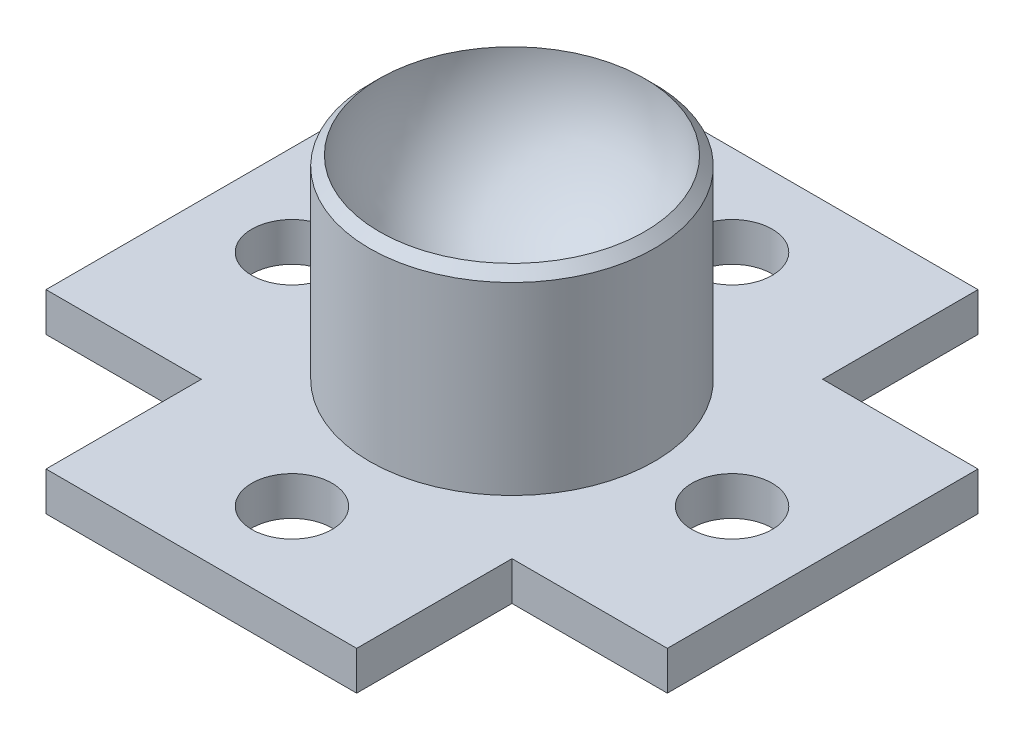
ISO-10303-21;
HEADER;
FILE_DESCRIPTION(('STEP AP214'),'2;1');
FILE_NAME('part.step','',(''),(''),'','','');
FILE_SCHEMA(('AUTOMOTIVE_DESIGN { 1 0 10303 214 1 1 1 1 }'));
ENDSEC;
DATA;
#1=APPLICATION_CONTEXT('core data for automotive mechanical design processes');
#2=APPLICATION_PROTOCOL_DEFINITION('international standard','automotive_design',2000,#1);
#3=PRODUCT_CONTEXT('',#1,'mechanical');
#4=PRODUCT('Part','Part','',(#3));
#5=PRODUCT_RELATED_PRODUCT_CATEGORY('part','',(#4));
#6=PRODUCT_DEFINITION_FORMATION('','',#4);
#7=PRODUCT_DEFINITION_CONTEXT('part definition',#1,'design');
#8=PRODUCT_DEFINITION('design','',#6,#7);
#9=PRODUCT_DEFINITION_SHAPE('','',#8);
#10=(LENGTH_UNIT() NAMED_UNIT(*) SI_UNIT(.MILLI.,.METRE.));
#11=(NAMED_UNIT(*) PLANE_ANGLE_UNIT() SI_UNIT($,.RADIAN.));
#12=(NAMED_UNIT(*) SI_UNIT($,.STERADIAN.) SOLID_ANGLE_UNIT());
#13=UNCERTAINTY_MEASURE_WITH_UNIT(LENGTH_MEASURE(1.E-05),#10,'distance_accuracy_value','');
#14=(GEOMETRIC_REPRESENTATION_CONTEXT(3) GLOBAL_UNCERTAINTY_ASSIGNED_CONTEXT((#13)) GLOBAL_UNIT_ASSIGNED_CONTEXT((#10,
#11,#12)) REPRESENTATION_CONTEXT('',''));
#15=CARTESIAN_POINT('',(0.,0.,0.));
#16=DIRECTION('',(0.,0.,1.));
#17=DIRECTION('',(1.,0.,0.));
#18=AXIS2_PLACEMENT_3D('',#15,#16,#17);
#19=CARTESIAN_POINT('',(0.,3.,0.));
#20=DIRECTION('',(0.,1.,0.));
#21=DIRECTION('',(0.,0.,1.));
#22=AXIS2_PLACEMENT_3D('',#19,#20,#21);
#23=PLANE('',#22);
#24=CARTESIAN_POINT('',(0.,3.,0.));
#25=DIRECTION('',(0.,1.,0.));
#26=DIRECTION('',(0.,0.,1.));
#27=AXIS2_PLACEMENT_3D('',#24,#25,#26);
#28=CIRCLE('',#27,11.);
#29=CARTESIAN_POINT('',(0.,3.,11.));
#30=VERTEX_POINT('',#29);
#31=EDGE_CURVE('E432',#30,#30,#28,.T.);
#32=ORIENTED_EDGE('',*,*,#31,.F.);
#33=EDGE_LOOP('',(#32));
#34=FACE_BOUND('',#33,.T.);
#35=CARTESIAN_POINT('',(-17.,3.,0.));
#36=DIRECTION('',(0.,1.,0.));
#37=DIRECTION('',(0.,0.,1.));
#38=AXIS2_PLACEMENT_3D('',#35,#36,#37);
#39=CIRCLE('',#38,3.1);
#40=CARTESIAN_POINT('',(-17.,3.,3.1));
#41=VERTEX_POINT('',#40);
#42=EDGE_CURVE('E330',#41,#41,#39,.T.);
#43=ORIENTED_EDGE('',*,*,#42,.F.);
#44=EDGE_LOOP('',(#43));
#45=FACE_BOUND('',#44,.T.);
#46=DIRECTION('',(0.,0.,1.));
#47=VECTOR('',#46,1.);
#48=CARTESIAN_POINT('',(-24.,3.,-12.));
#49=LINE('',#48,#47);
#50=CARTESIAN_POINT('',(-24.,3.,-12.));
#51=VERTEX_POINT('',#50);
#52=CARTESIAN_POINT('',(-24.,3.,12.));
#53=VERTEX_POINT('',#52);
#54=EDGE_CURVE('E357',#51,#53,#49,.T.);
#55=ORIENTED_EDGE('',*,*,#54,.T.);
#56=DIRECTION('',(1.,0.,0.));
#57=VECTOR('',#56,1.);
#58=CARTESIAN_POINT('',(-24.,3.,12.));
#59=LINE('',#58,#57);
#60=CARTESIAN_POINT('',(-12.,3.,12.));
#61=VERTEX_POINT('',#60);
#62=EDGE_CURVE('E272',#53,#61,#59,.T.);
#63=ORIENTED_EDGE('',*,*,#62,.T.);
#64=DIRECTION('',(0.,0.,1.));
#65=VECTOR('',#64,1.);
#66=CARTESIAN_POINT('',(-12.,3.,12.));
#67=LINE('',#66,#65);
#68=CARTESIAN_POINT('',(-12.,3.,24.));
#69=VERTEX_POINT('',#68);
#70=EDGE_CURVE('E462',#61,#69,#67,.T.);
#71=ORIENTED_EDGE('',*,*,#70,.T.);
#72=DIRECTION('',(-1.,0.,0.));
#73=VECTOR('',#72,1.);
#74=CARTESIAN_POINT('',(12.,3.,24.));
#75=LINE('',#74,#73);
#76=CARTESIAN_POINT('',(12.,3.,24.));
#77=VERTEX_POINT('',#76);
#78=EDGE_CURVE('E464',#77,#69,#75,.T.);
#79=ORIENTED_EDGE('',*,*,#78,.F.);
#80=DIRECTION('',(0.,0.,1.));
#81=VECTOR('',#80,1.);
#82=CARTESIAN_POINT('',(12.,3.,12.));
#83=LINE('',#82,#81);
#84=CARTESIAN_POINT('',(12.,3.,12.));
#85=VERTEX_POINT('',#84);
#86=EDGE_CURVE('E467',#85,#77,#83,.T.);
#87=ORIENTED_EDGE('',*,*,#86,.F.);
#88=DIRECTION('',(-1.,0.,0.));
#89=VECTOR('',#88,1.);
#90=CARTESIAN_POINT('',(24.,3.,12.));
#91=LINE('',#90,#89);
#92=CARTESIAN_POINT('',(24.,3.,12.));
#93=VERTEX_POINT('',#92);
#94=EDGE_CURVE('E470',#93,#85,#91,.T.);
#95=ORIENTED_EDGE('',*,*,#94,.F.);
#96=DIRECTION('',(0.,0.,1.));
#97=VECTOR('',#96,1.);
#98=CARTESIAN_POINT('',(24.,3.,-12.));
#99=LINE('',#98,#97);
#100=CARTESIAN_POINT('',(24.,3.,-12.));
#101=VERTEX_POINT('',#100);
#102=EDGE_CURVE('E473',#101,#93,#99,.T.);
#103=ORIENTED_EDGE('',*,*,#102,.F.);
#104=DIRECTION('',(-1.,0.,0.));
#105=VECTOR('',#104,1.);
#106=CARTESIAN_POINT('',(24.,3.,-12.));
#107=LINE('',#106,#105);
#108=CARTESIAN_POINT('',(12.,3.,-12.));
#109=VERTEX_POINT('',#108);
#110=EDGE_CURVE('E476',#101,#109,#107,.T.);
#111=ORIENTED_EDGE('',*,*,#110,.T.);
#112=DIRECTION('',(0.,0.,-1.));
#113=VECTOR('',#112,1.);
#114=CARTESIAN_POINT('',(12.,3.,-12.));
#115=LINE('',#114,#113);
#116=CARTESIAN_POINT('',(12.,3.,-24.));
#117=VERTEX_POINT('',#116);
#118=EDGE_CURVE('E307',#109,#117,#115,.T.);
#119=ORIENTED_EDGE('',*,*,#118,.T.);
#120=DIRECTION('',(-1.,0.,0.));
#121=VECTOR('',#120,1.);
#122=CARTESIAN_POINT('',(12.,3.,-24.));
#123=LINE('',#122,#121);
#124=CARTESIAN_POINT('',(-12.,3.,-24.));
#125=VERTEX_POINT('',#124);
#126=EDGE_CURVE('E300',#117,#125,#123,.T.);
#127=ORIENTED_EDGE('',*,*,#126,.T.);
#128=DIRECTION('',(0.,0.,-1.));
#129=VECTOR('',#128,1.);
#130=CARTESIAN_POINT('',(-12.,3.,-12.));
#131=LINE('',#130,#129);
#132=CARTESIAN_POINT('',(-12.,3.,-12.));
#133=VERTEX_POINT('',#132);
#134=EDGE_CURVE('E305',#133,#125,#131,.T.);
#135=ORIENTED_EDGE('',*,*,#134,.F.);
#136=DIRECTION('',(1.,0.,0.));
#137=VECTOR('',#136,1.);
#138=CARTESIAN_POINT('',(-24.,3.,-12.));
#139=LINE('',#138,#137);
#140=EDGE_CURVE('E322',#51,#133,#139,.T.);
#141=ORIENTED_EDGE('',*,*,#140,.F.);
#142=EDGE_LOOP('',(#55,#63,#71,#79,#87,#95,#103,#111,#119,#127,#135,#141));
#143=FACE_BOUND('',#142,.T.);
#144=CARTESIAN_POINT('',(0.,3.,-17.));
#145=DIRECTION('',(0.,1.,0.));
#146=DIRECTION('',(0.,0.,1.));
#147=AXIS2_PLACEMENT_3D('',#144,#145,#146);
#148=CIRCLE('',#147,3.1);
#149=CARTESIAN_POINT('',(0.,3.,-13.9));
#150=VERTEX_POINT('',#149);
#151=EDGE_CURVE('E450',#150,#150,#148,.F.);
#152=ORIENTED_EDGE('',*,*,#151,.T.);
#153=EDGE_LOOP('',(#152));
#154=FACE_BOUND('',#153,.T.);
#155=CARTESIAN_POINT('',(17.,3.,0.));
#156=DIRECTION('',(0.,1.,0.));
#157=DIRECTION('',(0.,0.,1.));
#158=AXIS2_PLACEMENT_3D('',#155,#156,#157);
#159=CIRCLE('',#158,3.1);
#160=CARTESIAN_POINT('',(17.,3.,3.1));
#161=VERTEX_POINT('',#160);
#162=EDGE_CURVE('E444',#161,#161,#159,.F.);
#163=ORIENTED_EDGE('',*,*,#162,.T.);
#164=EDGE_LOOP('',(#163));
#165=FACE_BOUND('',#164,.T.);
#166=CARTESIAN_POINT('',(0.,3.,17.));
#167=DIRECTION('',(0.,1.,0.));
#168=DIRECTION('',(0.,0.,1.));
#169=AXIS2_PLACEMENT_3D('',#166,#167,#168);
#170=CIRCLE('',#169,3.1);
#171=CARTESIAN_POINT('',(0.,3.,20.1));
#172=VERTEX_POINT('',#171);
#173=EDGE_CURVE('E438',#172,#172,#170,.T.);
#174=ORIENTED_EDGE('',*,*,#173,.F.);
#175=EDGE_LOOP('',(#174));
#176=FACE_BOUND('',#175,.T.);
#177=ADVANCED_FACE('F203',(#34,#45,#143,#154,#165,#176),#23,.T.);
#178=CARTESIAN_POINT('',(0.,0.,0.));
#179=DIRECTION('',(0.,1.,0.));
#180=DIRECTION('',(0.,0.,1.));
#181=AXIS2_PLACEMENT_3D('',#178,#179,#180);
#182=PLANE('',#181);
#183=CARTESIAN_POINT('',(17.,0.,0.));
#184=DIRECTION('',(0.,1.,0.));
#185=DIRECTION('',(0.,0.,1.));
#186=AXIS2_PLACEMENT_3D('',#183,#184,#185);
#187=CIRCLE('',#186,3.1);
#188=CARTESIAN_POINT('',(17.,0.,3.1));
#189=VERTEX_POINT('',#188);
#190=EDGE_CURVE('E441',#189,#189,#187,.F.);
#191=ORIENTED_EDGE('',*,*,#190,.F.);
#192=EDGE_LOOP('',(#191));
#193=FACE_BOUND('',#192,.T.);
#194=CARTESIAN_POINT('',(0.,0.,-17.));
#195=DIRECTION('',(0.,1.,0.));
#196=DIRECTION('',(0.,0.,1.));
#197=AXIS2_PLACEMENT_3D('',#194,#195,#196);
#198=CIRCLE('',#197,3.1);
#199=CARTESIAN_POINT('',(0.,0.,-13.9));
#200=VERTEX_POINT('',#199);
#201=EDGE_CURVE('E447',#200,#200,#198,.F.);
#202=ORIENTED_EDGE('',*,*,#201,.F.);
#203=EDGE_LOOP('',(#202));
#204=FACE_BOUND('',#203,.T.);
#205=DIRECTION('',(0.,0.,1.));
#206=VECTOR('',#205,1.);
#207=CARTESIAN_POINT('',(-24.,0.,-12.));
#208=LINE('',#207,#206);
#209=CARTESIAN_POINT('',(-24.,0.,-12.));
#210=VERTEX_POINT('',#209);
#211=CARTESIAN_POINT('',(-24.,0.,12.));
#212=VERTEX_POINT('',#211);
#213=EDGE_CURVE('E327',#210,#212,#208,.T.);
#214=ORIENTED_EDGE('',*,*,#213,.F.);
#215=DIRECTION('',(1.,0.,0.));
#216=VECTOR('',#215,1.);
#217=CARTESIAN_POINT('',(-24.,0.,-12.));
#218=LINE('',#217,#216);
#219=CARTESIAN_POINT('',(-12.,0.,-12.));
#220=VERTEX_POINT('',#219);
#221=EDGE_CURVE('E354',#210,#220,#218,.T.);
#222=ORIENTED_EDGE('',*,*,#221,.T.);
#223=DIRECTION('',(0.,0.,-1.));
#224=VECTOR('',#223,1.);
#225=CARTESIAN_POINT('',(-12.,0.,-12.));
#226=LINE('',#225,#224);
#227=CARTESIAN_POINT('',(-12.,0.,-24.));
#228=VERTEX_POINT('',#227);
#229=EDGE_CURVE('E352',#220,#228,#226,.T.);
#230=ORIENTED_EDGE('',*,*,#229,.T.);
#231=DIRECTION('',(-1.,0.,0.));
#232=VECTOR('',#231,1.);
#233=CARTESIAN_POINT('',(12.,0.,-24.));
#234=LINE('',#233,#232);
#235=CARTESIAN_POINT('',(12.,0.,-24.));
#236=VERTEX_POINT('',#235);
#237=EDGE_CURVE('E316',#236,#228,#234,.T.);
#238=ORIENTED_EDGE('',*,*,#237,.F.);
#239=DIRECTION('',(0.,0.,-1.));
#240=VECTOR('',#239,1.);
#241=CARTESIAN_POINT('',(12.,0.,-12.));
#242=LINE('',#241,#240);
#243=CARTESIAN_POINT('',(12.,0.,-12.));
#244=VERTEX_POINT('',#243);
#245=EDGE_CURVE('E349',#244,#236,#242,.T.);
#246=ORIENTED_EDGE('',*,*,#245,.F.);
#247=DIRECTION('',(-1.,0.,0.));
#248=VECTOR('',#247,1.);
#249=CARTESIAN_POINT('',(24.,0.,-12.));
#250=LINE('',#249,#248);
#251=CARTESIAN_POINT('',(24.,0.,-12.));
#252=VERTEX_POINT('',#251);
#253=EDGE_CURVE('E347',#252,#244,#250,.T.);
#254=ORIENTED_EDGE('',*,*,#253,.F.);
#255=DIRECTION('',(0.,0.,1.));
#256=VECTOR('',#255,1.);
#257=CARTESIAN_POINT('',(24.,0.,-12.));
#258=LINE('',#257,#256);
#259=CARTESIAN_POINT('',(24.,0.,12.));
#260=VERTEX_POINT('',#259);
#261=EDGE_CURVE('E344',#252,#260,#258,.T.);
#262=ORIENTED_EDGE('',*,*,#261,.T.);
#263=DIRECTION('',(-1.,0.,0.));
#264=VECTOR('',#263,1.);
#265=CARTESIAN_POINT('',(24.,0.,12.));
#266=LINE('',#265,#264);
#267=CARTESIAN_POINT('',(12.,0.,12.));
#268=VERTEX_POINT('',#267);
#269=EDGE_CURVE('E341',#260,#268,#266,.T.);
#270=ORIENTED_EDGE('',*,*,#269,.T.);
#271=DIRECTION('',(0.,0.,1.));
#272=VECTOR('',#271,1.);
#273=CARTESIAN_POINT('',(12.,0.,12.));
#274=LINE('',#273,#272);
#275=CARTESIAN_POINT('',(12.,0.,24.));
#276=VERTEX_POINT('',#275);
#277=EDGE_CURVE('E338',#268,#276,#274,.T.);
#278=ORIENTED_EDGE('',*,*,#277,.T.);
#279=DIRECTION('',(-1.,0.,0.));
#280=VECTOR('',#279,1.);
#281=CARTESIAN_POINT('',(12.,0.,24.));
#282=LINE('',#281,#280);
#283=CARTESIAN_POINT('',(-12.,0.,24.));
#284=VERTEX_POINT('',#283);
#285=EDGE_CURVE('E335',#276,#284,#282,.T.);
#286=ORIENTED_EDGE('',*,*,#285,.T.);
#287=DIRECTION('',(0.,0.,1.));
#288=VECTOR('',#287,1.);
#289=CARTESIAN_POINT('',(-12.,0.,12.));
#290=LINE('',#289,#288);
#291=CARTESIAN_POINT('',(-12.,0.,12.));
#292=VERTEX_POINT('',#291);
#293=EDGE_CURVE('E332',#292,#284,#290,.T.);
#294=ORIENTED_EDGE('',*,*,#293,.F.);
#295=DIRECTION('',(1.,0.,0.));
#296=VECTOR('',#295,1.);
#297=CARTESIAN_POINT('',(-24.,0.,12.));
#298=LINE('',#297,#296);
#299=EDGE_CURVE('E329',#212,#292,#298,.T.);
#300=ORIENTED_EDGE('',*,*,#299,.F.);
#301=EDGE_LOOP('',(#214,#222,#230,#238,#246,#254,#262,#270,#278,#286,#294,#300));
#302=FACE_BOUND('',#301,.T.);
#303=CARTESIAN_POINT('',(-17.,0.,0.));
#304=DIRECTION('',(0.,1.,0.));
#305=DIRECTION('',(0.,0.,1.));
#306=AXIS2_PLACEMENT_3D('',#303,#304,#305);
#307=CIRCLE('',#306,3.1);
#308=CARTESIAN_POINT('',(-17.,0.,3.1));
#309=VERTEX_POINT('',#308);
#310=EDGE_CURVE('E453',#309,#309,#307,.T.);
#311=ORIENTED_EDGE('',*,*,#310,.T.);
#312=EDGE_LOOP('',(#311));
#313=FACE_BOUND('',#312,.T.);
#314=CARTESIAN_POINT('',(0.,0.,17.));
#315=DIRECTION('',(0.,1.,0.));
#316=DIRECTION('',(0.,0.,1.));
#317=AXIS2_PLACEMENT_3D('',#314,#315,#316);
#318=CIRCLE('',#317,3.1);
#319=CARTESIAN_POINT('',(0.,0.,20.1));
#320=VERTEX_POINT('',#319);
#321=EDGE_CURVE('E435',#320,#320,#318,.T.);
#322=ORIENTED_EDGE('',*,*,#321,.T.);
#323=EDGE_LOOP('',(#322));
#324=FACE_BOUND('',#323,.T.);
#325=ADVANCED_FACE('F380',(#193,#204,#302,#313,#324),#182,.F.);
#326=CARTESIAN_POINT('',(-24.,3.,-12.));
#327=DIRECTION('',(1.,0.,0.));
#328=DIRECTION('',(0.,0.,-1.));
#329=AXIS2_PLACEMENT_3D('',#326,#327,#328);
#330=PLANE('',#329);
#331=ORIENTED_EDGE('',*,*,#213,.T.);
#332=DIRECTION('',(0.,-1.,0.));
#333=VECTOR('',#332,1.);
#334=CARTESIAN_POINT('',(-24.,3.,12.));
#335=LINE('',#334,#333);
#336=EDGE_CURVE('E213',#53,#212,#335,.T.);
#337=ORIENTED_EDGE('',*,*,#336,.F.);
#338=ORIENTED_EDGE('',*,*,#54,.F.);
#339=DIRECTION('',(0.,-1.,0.));
#340=VECTOR('',#339,1.);
#341=CARTESIAN_POINT('',(-24.,3.,-12.));
#342=LINE('',#341,#340);
#343=EDGE_CURVE('E221',#51,#210,#342,.T.);
#344=ORIENTED_EDGE('',*,*,#343,.T.);
#345=EDGE_LOOP('',(#331,#337,#338,#344));
#346=FACE_BOUND('',#345,.T.);
#347=ADVANCED_FACE('F378',(#346),#330,.F.);
#348=CARTESIAN_POINT('',(-24.,3.,12.));
#349=DIRECTION('',(0.,0.,-1.));
#350=DIRECTION('',(-1.,0.,0.));
#351=AXIS2_PLACEMENT_3D('',#348,#349,#350);
#352=PLANE('',#351);
#353=ORIENTED_EDGE('',*,*,#299,.T.);
#354=DIRECTION('',(0.,-1.,0.));
#355=VECTOR('',#354,1.);
#356=CARTESIAN_POINT('',(-12.,3.,12.));
#357=LINE('',#356,#355);
#358=EDGE_CURVE('E374',#61,#292,#357,.T.);
#359=ORIENTED_EDGE('',*,*,#358,.F.);
#360=ORIENTED_EDGE('',*,*,#62,.F.);
#361=ORIENTED_EDGE('',*,*,#336,.T.);
#362=EDGE_LOOP('',(#353,#359,#360,#361));
#363=FACE_BOUND('',#362,.T.);
#364=ADVANCED_FACE('F377',(#363),#352,.F.);
#365=CARTESIAN_POINT('',(-12.,3.,12.));
#366=DIRECTION('',(1.,0.,0.));
#367=DIRECTION('',(0.,0.,-1.));
#368=AXIS2_PLACEMENT_3D('',#365,#366,#367);
#369=PLANE('',#368);
#370=ORIENTED_EDGE('',*,*,#293,.T.);
#371=DIRECTION('',(0.,-1.,0.));
#372=VECTOR('',#371,1.);
#373=CARTESIAN_POINT('',(-12.,3.,24.));
#374=LINE('',#373,#372);
#375=EDGE_CURVE('E372',#69,#284,#374,.T.);
#376=ORIENTED_EDGE('',*,*,#375,.F.);
#377=ORIENTED_EDGE('',*,*,#70,.F.);
#378=ORIENTED_EDGE('',*,*,#358,.T.);
#379=EDGE_LOOP('',(#370,#376,#377,#378));
#380=FACE_BOUND('',#379,.T.);
#381=ADVANCED_FACE('F504',(#380),#369,.F.);
#382=CARTESIAN_POINT('',(12.,3.,24.));
#383=DIRECTION('',(0.,0.,1.));
#384=DIRECTION('',(1.,0.,0.));
#385=AXIS2_PLACEMENT_3D('',#382,#383,#384);
#386=PLANE('',#385);
#387=ORIENTED_EDGE('',*,*,#285,.F.);
#388=DIRECTION('',(0.,-1.,0.));
#389=VECTOR('',#388,1.);
#390=CARTESIAN_POINT('',(12.,3.,24.));
#391=LINE('',#390,#389);
#392=EDGE_CURVE('E370',#77,#276,#391,.T.);
#393=ORIENTED_EDGE('',*,*,#392,.F.);
#394=ORIENTED_EDGE('',*,*,#78,.T.);
#395=ORIENTED_EDGE('',*,*,#375,.T.);
#396=EDGE_LOOP('',(#387,#393,#394,#395));
#397=FACE_BOUND('',#396,.T.);
#398=ADVANCED_FACE('F500',(#397),#386,.T.);
#399=CARTESIAN_POINT('',(12.,3.,12.));
#400=DIRECTION('',(1.,0.,0.));
#401=DIRECTION('',(0.,0.,-1.));
#402=AXIS2_PLACEMENT_3D('',#399,#400,#401);
#403=PLANE('',#402);
#404=ORIENTED_EDGE('',*,*,#277,.F.);
#405=DIRECTION('',(0.,-1.,0.));
#406=VECTOR('',#405,1.);
#407=CARTESIAN_POINT('',(12.,3.,12.));
#408=LINE('',#407,#406);
#409=EDGE_CURVE('E368',#85,#268,#408,.T.);
#410=ORIENTED_EDGE('',*,*,#409,.F.);
#411=ORIENTED_EDGE('',*,*,#86,.T.);
#412=ORIENTED_EDGE('',*,*,#392,.T.);
#413=EDGE_LOOP('',(#404,#410,#411,#412));
#414=FACE_BOUND('',#413,.T.);
#415=ADVANCED_FACE('F496',(#414),#403,.T.);
#416=CARTESIAN_POINT('',(24.,3.,12.));
#417=DIRECTION('',(0.,0.,1.));
#418=DIRECTION('',(1.,0.,0.));
#419=AXIS2_PLACEMENT_3D('',#416,#417,#418);
#420=PLANE('',#419);
#421=ORIENTED_EDGE('',*,*,#269,.F.);
#422=DIRECTION('',(0.,-1.,0.));
#423=VECTOR('',#422,1.);
#424=CARTESIAN_POINT('',(24.,3.,12.));
#425=LINE('',#424,#423);
#426=EDGE_CURVE('E366',#93,#260,#425,.T.);
#427=ORIENTED_EDGE('',*,*,#426,.F.);
#428=ORIENTED_EDGE('',*,*,#94,.T.);
#429=ORIENTED_EDGE('',*,*,#409,.T.);
#430=EDGE_LOOP('',(#421,#427,#428,#429));
#431=FACE_BOUND('',#430,.T.);
#432=ADVANCED_FACE('F492',(#431),#420,.T.);
#433=CARTESIAN_POINT('',(24.,3.,-12.));
#434=DIRECTION('',(1.,0.,0.));
#435=DIRECTION('',(0.,0.,-1.));
#436=AXIS2_PLACEMENT_3D('',#433,#434,#435);
#437=PLANE('',#436);
#438=ORIENTED_EDGE('',*,*,#261,.F.);
#439=DIRECTION('',(0.,-1.,0.));
#440=VECTOR('',#439,1.);
#441=CARTESIAN_POINT('',(24.,3.,-12.));
#442=LINE('',#441,#440);
#443=EDGE_CURVE('E364',#101,#252,#442,.T.);
#444=ORIENTED_EDGE('',*,*,#443,.F.);
#445=ORIENTED_EDGE('',*,*,#102,.T.);
#446=ORIENTED_EDGE('',*,*,#426,.T.);
#447=EDGE_LOOP('',(#438,#444,#445,#446));
#448=FACE_BOUND('',#447,.T.);
#449=ADVANCED_FACE('F489',(#448),#437,.T.);
#450=CARTESIAN_POINT('',(24.,3.,-12.));
#451=DIRECTION('',(0.,0.,1.));
#452=DIRECTION('',(1.,0.,0.));
#453=AXIS2_PLACEMENT_3D('',#450,#451,#452);
#454=PLANE('',#453);
#455=ORIENTED_EDGE('',*,*,#253,.T.);
#456=DIRECTION('',(0.,-1.,0.));
#457=VECTOR('',#456,1.);
#458=CARTESIAN_POINT('',(12.,3.,-12.));
#459=LINE('',#458,#457);
#460=EDGE_CURVE('E361',#109,#244,#459,.T.);
#461=ORIENTED_EDGE('',*,*,#460,.F.);
#462=ORIENTED_EDGE('',*,*,#110,.F.);
#463=ORIENTED_EDGE('',*,*,#443,.T.);
#464=EDGE_LOOP('',(#455,#461,#462,#463));
#465=FACE_BOUND('',#464,.T.);
#466=ADVANCED_FACE('F482',(#465),#454,.F.);
#467=CARTESIAN_POINT('',(12.,3.,-12.));
#468=DIRECTION('',(-1.,0.,0.));
#469=DIRECTION('',(0.,0.,1.));
#470=AXIS2_PLACEMENT_3D('',#467,#468,#469);
#471=PLANE('',#470);
#472=ORIENTED_EDGE('',*,*,#245,.T.);
#473=DIRECTION('',(0.,-1.,0.));
#474=VECTOR('',#473,1.);
#475=CARTESIAN_POINT('',(12.,3.,-24.));
#476=LINE('',#475,#474);
#477=EDGE_CURVE('E319',#117,#236,#476,.T.);
#478=ORIENTED_EDGE('',*,*,#477,.F.);
#479=ORIENTED_EDGE('',*,*,#118,.F.);
#480=ORIENTED_EDGE('',*,*,#460,.T.);
#481=EDGE_LOOP('',(#472,#478,#479,#480));
#482=FACE_BOUND('',#481,.T.);
#483=ADVANCED_FACE('F486',(#482),#471,.F.);
#484=CARTESIAN_POINT('',(12.,3.,-24.));
#485=DIRECTION('',(0.,0.,1.));
#486=DIRECTION('',(1.,0.,0.));
#487=AXIS2_PLACEMENT_3D('',#484,#485,#486);
#488=PLANE('',#487);
#489=ORIENTED_EDGE('',*,*,#237,.T.);
#490=DIRECTION('',(0.,-1.,0.));
#491=VECTOR('',#490,1.);
#492=CARTESIAN_POINT('',(-12.,3.,-24.));
#493=LINE('',#492,#491);
#494=EDGE_CURVE('E313',#125,#228,#493,.T.);
#495=ORIENTED_EDGE('',*,*,#494,.F.);
#496=ORIENTED_EDGE('',*,*,#126,.F.);
#497=ORIENTED_EDGE('',*,*,#477,.T.);
#498=EDGE_LOOP('',(#489,#495,#496,#497));
#499=FACE_BOUND('',#498,.T.);
#500=ADVANCED_FACE('F314',(#499),#488,.F.);
#501=CARTESIAN_POINT('',(-12.,3.,-12.));
#502=DIRECTION('',(-1.,0.,0.));
#503=DIRECTION('',(0.,0.,1.));
#504=AXIS2_PLACEMENT_3D('',#501,#502,#503);
#505=PLANE('',#504);
#506=ORIENTED_EDGE('',*,*,#229,.F.);
#507=DIRECTION('',(0.,-1.,0.));
#508=VECTOR('',#507,1.);
#509=CARTESIAN_POINT('',(-12.,3.,-12.));
#510=LINE('',#509,#508);
#511=EDGE_CURVE('E259',#133,#220,#510,.T.);
#512=ORIENTED_EDGE('',*,*,#511,.F.);
#513=ORIENTED_EDGE('',*,*,#134,.T.);
#514=ORIENTED_EDGE('',*,*,#494,.T.);
#515=EDGE_LOOP('',(#506,#512,#513,#514));
#516=FACE_BOUND('',#515,.T.);
#517=ADVANCED_FACE('F321',(#516),#505,.T.);
#518=CARTESIAN_POINT('',(-24.,3.,-12.));
#519=DIRECTION('',(0.,0.,-1.));
#520=DIRECTION('',(-1.,0.,0.));
#521=AXIS2_PLACEMENT_3D('',#518,#519,#520);
#522=PLANE('',#521);
#523=ORIENTED_EDGE('',*,*,#221,.F.);
#524=ORIENTED_EDGE('',*,*,#343,.F.);
#525=ORIENTED_EDGE('',*,*,#140,.T.);
#526=ORIENTED_EDGE('',*,*,#511,.T.);
#527=EDGE_LOOP('',(#523,#524,#525,#526));
#528=FACE_BOUND('',#527,.T.);
#529=ADVANCED_FACE('F383',(#528),#522,.T.);
#530=CARTESIAN_POINT('',(-17.,3.,0.));
#531=DIRECTION('',(0.,-1.,0.));
#532=DIRECTION('',(0.,0.,-1.));
#533=AXIS2_PLACEMENT_3D('',#530,#531,#532);
#534=CYLINDRICAL_SURFACE('',#533,3.1);
#535=ORIENTED_EDGE('',*,*,#42,.T.);
#536=EDGE_LOOP('',(#535));
#537=FACE_BOUND('',#536,.T.);
#538=ORIENTED_EDGE('',*,*,#310,.F.);
#539=EDGE_LOOP('',(#538));
#540=FACE_BOUND('',#539,.T.);
#541=ADVANCED_FACE('F385',(#537,#540),#534,.F.);
#542=CARTESIAN_POINT('',(0.,3.,-17.));
#543=DIRECTION('',(0.,-1.,0.));
#544=DIRECTION('',(0.,0.,-1.));
#545=AXIS2_PLACEMENT_3D('',#542,#543,#544);
#546=CYLINDRICAL_SURFACE('',#545,3.1);
#547=ORIENTED_EDGE('',*,*,#151,.F.);
#548=EDGE_LOOP('',(#547));
#549=FACE_BOUND('',#548,.T.);
#550=ORIENTED_EDGE('',*,*,#201,.T.);
#551=EDGE_LOOP('',(#550));
#552=FACE_BOUND('',#551,.T.);
#553=ADVANCED_FACE('F391',(#549,#552),#546,.F.);
#554=CARTESIAN_POINT('',(17.,3.,0.));
#555=DIRECTION('',(0.,-1.,0.));
#556=DIRECTION('',(0.,0.,-1.));
#557=AXIS2_PLACEMENT_3D('',#554,#555,#556);
#558=CYLINDRICAL_SURFACE('',#557,3.1);
#559=ORIENTED_EDGE('',*,*,#162,.F.);
#560=EDGE_LOOP('',(#559));
#561=FACE_BOUND('',#560,.T.);
#562=ORIENTED_EDGE('',*,*,#190,.T.);
#563=EDGE_LOOP('',(#562));
#564=FACE_BOUND('',#563,.T.);
#565=ADVANCED_FACE('F410',(#561,#564),#558,.F.);
#566=CARTESIAN_POINT('',(0.,3.,17.));
#567=DIRECTION('',(0.,-1.,0.));
#568=DIRECTION('',(0.,0.,-1.));
#569=AXIS2_PLACEMENT_3D('',#566,#567,#568);
#570=CYLINDRICAL_SURFACE('',#569,3.1);
#571=ORIENTED_EDGE('',*,*,#173,.T.);
#572=EDGE_LOOP('',(#571));
#573=FACE_BOUND('',#572,.T.);
#574=ORIENTED_EDGE('',*,*,#321,.F.);
#575=EDGE_LOOP('',(#574));
#576=FACE_BOUND('',#575,.T.);
#577=ADVANCED_FACE('F414',(#573,#576),#570,.F.);
#578=CARTESIAN_POINT('',(0.,18.,0.));
#579=DIRECTION('',(0.,-1.,0.));
#580=DIRECTION('',(0.,0.,-1.));
#581=AXIS2_PLACEMENT_3D('',#578,#579,#580);
#582=CYLINDRICAL_SURFACE('',#581,11.);
#583=CARTESIAN_POINT('',(0.,17.25,0.));
#584=DIRECTION('',(0.,1.,0.));
#585=DIRECTION('',(0.,0.,1.));
#586=AXIS2_PLACEMENT_3D('',#583,#584,#585);
#587=CIRCLE('',#586,11.);
#588=CARTESIAN_POINT('',(0.,17.25,11.));
#589=VERTEX_POINT('',#588);
#590=EDGE_CURVE('E12',#589,#589,#587,.F.);
#591=ORIENTED_EDGE('',*,*,#590,.T.);
#592=EDGE_LOOP('',(#591));
#593=FACE_BOUND('',#592,.T.);
#594=ORIENTED_EDGE('',*,*,#31,.T.);
#595=EDGE_LOOP('',(#594));
#596=FACE_BOUND('',#595,.T.);
#597=ADVANCED_FACE('F417',(#593,#596),#582,.T.);
#598=CARTESIAN_POINT('',(0.,18.,0.));
#599=DIRECTION('',(0.,1.,0.));
#600=DIRECTION('',(-1.,0.,0.));
#601=AXIS2_PLACEMENT_3D('',#598,#599,#600);
#602=SPHERICAL_SURFACE('',#601,10.25);
#603=CARTESIAN_POINT('',(0.,18.,0.));
#604=DIRECTION('',(0.,1.,0.));
#605=DIRECTION('',(0.,0.,1.));
#606=AXIS2_PLACEMENT_3D('',#603,#604,#605);
#607=CIRCLE('',#606,10.25);
#608=CARTESIAN_POINT('',(0.,18.,10.25));
#609=VERTEX_POINT('',#608);
#610=EDGE_CURVE('E430',#609,#609,#607,.T.);
#611=ORIENTED_EDGE('',*,*,#610,.T.);
#612=EDGE_LOOP('',(#611));
#613=FACE_BOUND('',#612,.T.);
#614=ADVANCED_FACE('F421',(#613),#602,.F.);
#615=CARTESIAN_POINT('',(0.,18.,0.));
#616=DIRECTION('',(0.,-1.,0.));
#617=DIRECTION('',(0.,0.,-1.));
#618=AXIS2_PLACEMENT_3D('',#615,#616,#617);
#619=CONICAL_SURFACE('',#618,10.25,0.785398163397448);
#620=ORIENTED_EDGE('',*,*,#590,.F.);
#621=EDGE_LOOP('',(#620));
#622=FACE_BOUND('',#621,.T.);
#623=ORIENTED_EDGE('',*,*,#610,.F.);
#624=EDGE_LOOP('',(#623));
#625=FACE_BOUND('',#624,.T.);
#626=ADVANCED_FACE('F206',(#622,#625),#619,.T.);
#627=CLOSED_SHELL('',(#177,#325,#347,#364,#381,#398,#415,#432,#449,#466,#483,#500,#517,#529,
#541,#553,#565,#577,#597,#614,#626));
#628=MANIFOLD_SOLID_BREP('B2',#627);
#629=ADVANCED_BREP_SHAPE_REPRESENTATION('',(#18,#628),#14);
#630=SHAPE_DEFINITION_REPRESENTATION(#9,#629);
ENDSEC;
END-ISO-10303-21;
